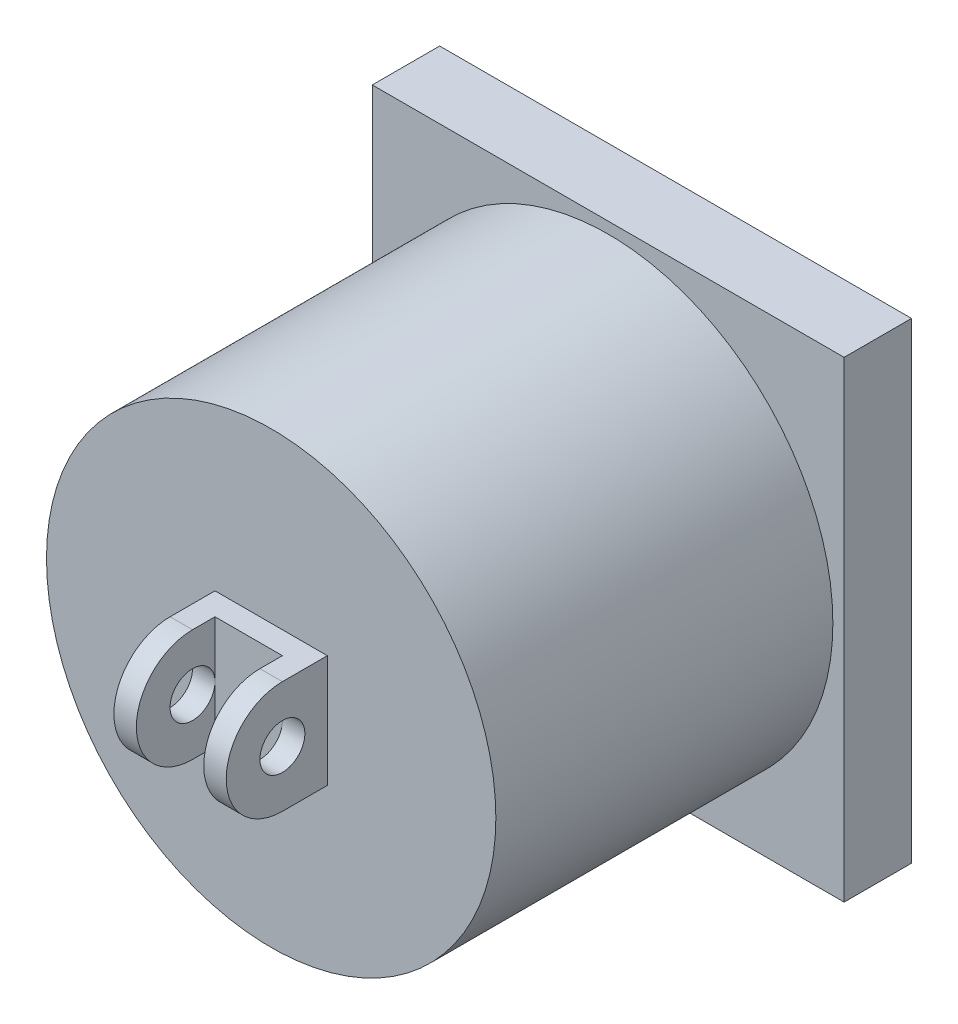
ISO-10303-21;
HEADER;
FILE_DESCRIPTION(('STEP AP214'),'2;1');
FILE_NAME('part.step','',(''),(''),'','','');
FILE_SCHEMA(('AUTOMOTIVE_DESIGN { 1 0 10303 214 1 1 1 1 }'));
ENDSEC;
DATA;
#1=APPLICATION_CONTEXT('core data for automotive mechanical design processes');
#2=APPLICATION_PROTOCOL_DEFINITION('international standard','automotive_design',2000,#1);
#3=PRODUCT_CONTEXT('',#1,'mechanical');
#4=PRODUCT('Part','Part','',(#3));
#5=PRODUCT_RELATED_PRODUCT_CATEGORY('part','',(#4));
#6=PRODUCT_DEFINITION_FORMATION('','',#4);
#7=PRODUCT_DEFINITION_CONTEXT('part definition',#1,'design');
#8=PRODUCT_DEFINITION('design','',#6,#7);
#9=PRODUCT_DEFINITION_SHAPE('','',#8);
#10=(LENGTH_UNIT() NAMED_UNIT(*) SI_UNIT(.MILLI.,.METRE.));
#11=(NAMED_UNIT(*) PLANE_ANGLE_UNIT() SI_UNIT($,.RADIAN.));
#12=(NAMED_UNIT(*) SI_UNIT($,.STERADIAN.) SOLID_ANGLE_UNIT());
#13=UNCERTAINTY_MEASURE_WITH_UNIT(LENGTH_MEASURE(1.E-05),#10,'distance_accuracy_value','');
#14=(GEOMETRIC_REPRESENTATION_CONTEXT(3) GLOBAL_UNCERTAINTY_ASSIGNED_CONTEXT((#13)) GLOBAL_UNIT_ASSIGNED_CONTEXT((#10,
#11,#12)) REPRESENTATION_CONTEXT('',''));
#15=CARTESIAN_POINT('',(0.,0.,0.));
#16=DIRECTION('',(0.,0.,1.));
#17=DIRECTION('',(1.,0.,0.));
#18=AXIS2_PLACEMENT_3D('',#15,#16,#17);
#19=CARTESIAN_POINT('',(2.5,0.,17.));
#20=DIRECTION('',(-1.,0.,0.));
#21=DIRECTION('',(0.,0.,1.));
#22=AXIS2_PLACEMENT_3D('',#19,#20,#21);
#23=CYLINDRICAL_SURFACE('',#22,2.5);
#24=DIRECTION('',(-1.,0.,0.));
#25=VECTOR('',#24,1.);
#26=CARTESIAN_POINT('',(2.5,2.5,17.));
#27=LINE('',#26,#25);
#28=CARTESIAN_POINT('',(2.5,2.5,17.));
#29=VERTEX_POINT('',#28);
#30=CARTESIAN_POINT('',(1.5,2.5,17.));
#31=VERTEX_POINT('',#30);
#32=EDGE_CURVE('E201',#29,#31,#27,.T.);
#33=ORIENTED_EDGE('',*,*,#32,.T.);
#34=CARTESIAN_POINT('',(1.5,0.,17.));
#35=DIRECTION('',(1.,0.,0.));
#36=DIRECTION('',(0.,1.,0.));
#37=AXIS2_PLACEMENT_3D('',#34,#35,#36);
#38=CIRCLE('',#37,2.5);
#39=CARTESIAN_POINT('',(1.5,-2.5,17.));
#40=VERTEX_POINT('',#39);
#41=EDGE_CURVE('E162',#31,#40,#38,.T.);
#42=ORIENTED_EDGE('',*,*,#41,.T.);
#43=DIRECTION('',(-1.,0.,0.));
#44=VECTOR('',#43,1.);
#45=CARTESIAN_POINT('',(2.5,-2.5,17.));
#46=LINE('',#45,#44);
#47=CARTESIAN_POINT('',(2.5,-2.5,17.));
#48=VERTEX_POINT('',#47);
#49=EDGE_CURVE('E153',#48,#40,#46,.T.);
#50=ORIENTED_EDGE('',*,*,#49,.F.);
#51=CARTESIAN_POINT('',(2.5,0.,17.));
#52=DIRECTION('',(1.,0.,0.));
#53=DIRECTION('',(0.,0.,-1.));
#54=AXIS2_PLACEMENT_3D('',#51,#52,#53);
#55=CIRCLE('',#54,2.5);
#56=EDGE_CURVE('E176',#29,#48,#55,.T.);
#57=ORIENTED_EDGE('',*,*,#56,.F.);
#58=EDGE_LOOP('',(#33,#42,#50,#57));
#59=FACE_BOUND('',#58,.T.);
#60=ADVANCED_FACE('F37',(#59),#23,.T.);
#61=CARTESIAN_POINT('',(2.5,0.,17.));
#62=DIRECTION('',(-1.,0.,0.));
#63=DIRECTION('',(0.,0.,1.));
#64=AXIS2_PLACEMENT_3D('',#61,#62,#63);
#65=CYLINDRICAL_SURFACE('',#64,1.);
#66=CARTESIAN_POINT('',(-1.5,0.,17.));
#67=DIRECTION('',(-1.,0.,0.));
#68=DIRECTION('',(0.,-1.,0.));
#69=AXIS2_PLACEMENT_3D('',#66,#67,#68);
#70=CIRCLE('',#69,1.);
#71=CARTESIAN_POINT('',(-1.5,0.,16.));
#72=VERTEX_POINT('',#71);
#73=EDGE_CURVE('E11',#72,#72,#70,.T.);
#74=ORIENTED_EDGE('',*,*,#73,.F.);
#75=EDGE_LOOP('',(#74));
#76=FACE_BOUND('',#75,.T.);
#77=CARTESIAN_POINT('',(-2.5,0.,17.));
#78=DIRECTION('',(1.,0.,0.));
#79=DIRECTION('',(0.,0.,-1.));
#80=AXIS2_PLACEMENT_3D('',#77,#78,#79);
#81=CIRCLE('',#80,1.);
#82=CARTESIAN_POINT('',(-2.5,0.,16.));
#83=VERTEX_POINT('',#82);
#84=EDGE_CURVE('E166',#83,#83,#81,.T.);
#85=ORIENTED_EDGE('',*,*,#84,.F.);
#86=EDGE_LOOP('',(#85));
#87=FACE_BOUND('',#86,.T.);
#88=ADVANCED_FACE('F275',(#76,#87),#65,.F.);
#89=CARTESIAN_POINT('',(0.,0.,15.));
#90=DIRECTION('',(0.,0.,1.));
#91=DIRECTION('',(1.,0.,0.));
#92=AXIS2_PLACEMENT_3D('',#89,#90,#91);
#93=PLANE('',#92);
#94=CARTESIAN_POINT('',(0.,0.,15.));
#95=DIRECTION('',(0.,0.,1.));
#96=DIRECTION('',(1.,0.,0.));
#97=AXIS2_PLACEMENT_3D('',#94,#95,#96);
#98=CIRCLE('',#97,10.);
#99=CARTESIAN_POINT('',(10.,0.,15.));
#100=VERTEX_POINT('',#99);
#101=EDGE_CURVE('E235',#100,#100,#98,.T.);
#102=ORIENTED_EDGE('',*,*,#101,.T.);
#103=EDGE_LOOP('',(#102));
#104=FACE_BOUND('',#103,.T.);
#105=DIRECTION('',(-1.,0.,0.));
#106=VECTOR('',#105,1.);
#107=CARTESIAN_POINT('',(2.5,-2.5,15.));
#108=LINE('',#107,#106);
#109=CARTESIAN_POINT('',(2.5,-2.5,15.));
#110=VERTEX_POINT('',#109);
#111=CARTESIAN_POINT('',(-2.5,-2.5,15.));
#112=VERTEX_POINT('',#111);
#113=EDGE_CURVE('E195',#110,#112,#108,.T.);
#114=ORIENTED_EDGE('',*,*,#113,.T.);
#115=DIRECTION('',(0.,1.,0.));
#116=VECTOR('',#115,1.);
#117=CARTESIAN_POINT('',(-2.5,2.5,15.));
#118=LINE('',#117,#116);
#119=CARTESIAN_POINT('',(-2.5,2.5,15.));
#120=VERTEX_POINT('',#119);
#121=EDGE_CURVE('E177',#112,#120,#118,.T.);
#122=ORIENTED_EDGE('',*,*,#121,.T.);
#123=DIRECTION('',(-1.,0.,0.));
#124=VECTOR('',#123,1.);
#125=CARTESIAN_POINT('',(2.5,2.5,15.));
#126=LINE('',#125,#124);
#127=CARTESIAN_POINT('',(2.5,2.5,15.));
#128=VERTEX_POINT('',#127);
#129=EDGE_CURVE('E183',#128,#120,#126,.T.);
#130=ORIENTED_EDGE('',*,*,#129,.F.);
#131=DIRECTION('',(0.,1.,0.));
#132=VECTOR('',#131,1.);
#133=CARTESIAN_POINT('',(2.5,2.5,15.));
#134=LINE('',#133,#132);
#135=EDGE_CURVE('E181',#110,#128,#134,.T.);
#136=ORIENTED_EDGE('',*,*,#135,.F.);
#137=EDGE_LOOP('',(#114,#122,#130,#136));
#138=FACE_BOUND('',#137,.T.);
#139=ADVANCED_FACE('F282',(#104,#138),#93,.T.);
#140=CARTESIAN_POINT('',(0.,0.,15.));
#141=DIRECTION('',(0.,0.,-1.));
#142=DIRECTION('',(-1.,0.,0.));
#143=AXIS2_PLACEMENT_3D('',#140,#141,#142);
#144=CYLINDRICAL_SURFACE('',#143,10.);
#145=ORIENTED_EDGE('',*,*,#101,.F.);
#146=EDGE_LOOP('',(#145));
#147=FACE_BOUND('',#146,.T.);
#148=CARTESIAN_POINT('',(0.,0.,0.));
#149=DIRECTION('',(0.,0.,1.));
#150=DIRECTION('',(1.,0.,0.));
#151=AXIS2_PLACEMENT_3D('',#148,#149,#150);
#152=CIRCLE('',#151,10.);
#153=CARTESIAN_POINT('',(10.,0.,0.));
#154=VERTEX_POINT('',#153);
#155=EDGE_CURVE('E234',#154,#154,#152,.T.);
#156=ORIENTED_EDGE('',*,*,#155,.T.);
#157=EDGE_LOOP('',(#156));
#158=FACE_BOUND('',#157,.T.);
#159=ADVANCED_FACE('F39',(#147,#158),#144,.T.);
#160=CARTESIAN_POINT('',(10.5,-10.5,-3.));
#161=DIRECTION('',(-1.,0.,0.));
#162=DIRECTION('',(0.,0.,1.));
#163=AXIS2_PLACEMENT_3D('',#160,#161,#162);
#164=PLANE('',#163);
#165=DIRECTION('',(0.,-1.,0.));
#166=VECTOR('',#165,1.);
#167=CARTESIAN_POINT('',(10.5,-10.5,0.));
#168=LINE('',#167,#166);
#169=CARTESIAN_POINT('',(10.5,10.5,0.));
#170=VERTEX_POINT('',#169);
#171=CARTESIAN_POINT('',(10.5,-10.5,0.));
#172=VERTEX_POINT('',#171);
#173=EDGE_CURVE('E204',#170,#172,#168,.T.);
#174=ORIENTED_EDGE('',*,*,#173,.T.);
#175=DIRECTION('',(0.,0.,1.));
#176=VECTOR('',#175,1.);
#177=CARTESIAN_POINT('',(10.5,-10.5,-3.));
#178=LINE('',#177,#176);
#179=CARTESIAN_POINT('',(10.5,-10.5,-3.));
#180=VERTEX_POINT('',#179);
#181=EDGE_CURVE('E231',#180,#172,#178,.T.);
#182=ORIENTED_EDGE('',*,*,#181,.F.);
#183=DIRECTION('',(0.,-1.,0.));
#184=VECTOR('',#183,1.);
#185=CARTESIAN_POINT('',(10.5,-10.5,-3.));
#186=LINE('',#185,#184);
#187=CARTESIAN_POINT('',(10.5,10.5,-3.));
#188=VERTEX_POINT('',#187);
#189=EDGE_CURVE('E205',#188,#180,#186,.T.);
#190=ORIENTED_EDGE('',*,*,#189,.F.);
#191=DIRECTION('',(0.,0.,1.));
#192=VECTOR('',#191,1.);
#193=CARTESIAN_POINT('',(10.5,10.5,-3.));
#194=LINE('',#193,#192);
#195=EDGE_CURVE('E215',#188,#170,#194,.T.);
#196=ORIENTED_EDGE('',*,*,#195,.T.);
#197=EDGE_LOOP('',(#174,#182,#190,#196));
#198=FACE_BOUND('',#197,.T.);
#199=ADVANCED_FACE('F253',(#198),#164,.F.);
#200=CARTESIAN_POINT('',(-10.5,-10.5,-3.));
#201=DIRECTION('',(0.,1.,0.));
#202=DIRECTION('',(-1.,0.,0.));
#203=AXIS2_PLACEMENT_3D('',#200,#201,#202);
#204=PLANE('',#203);
#205=DIRECTION('',(-1.,0.,0.));
#206=VECTOR('',#205,1.);
#207=CARTESIAN_POINT('',(-10.5,-10.5,0.));
#208=LINE('',#207,#206);
#209=CARTESIAN_POINT('',(-10.5,-10.5,0.));
#210=VERTEX_POINT('',#209);
#211=EDGE_CURVE('E218',#172,#210,#208,.T.);
#212=ORIENTED_EDGE('',*,*,#211,.T.);
#213=DIRECTION('',(0.,0.,1.));
#214=VECTOR('',#213,1.);
#215=CARTESIAN_POINT('',(-10.5,-10.5,-3.));
#216=LINE('',#215,#214);
#217=CARTESIAN_POINT('',(-10.5,-10.5,-3.));
#218=VERTEX_POINT('',#217);
#219=EDGE_CURVE('E228',#218,#210,#216,.T.);
#220=ORIENTED_EDGE('',*,*,#219,.F.);
#221=DIRECTION('',(-1.,0.,0.));
#222=VECTOR('',#221,1.);
#223=CARTESIAN_POINT('',(-10.5,-10.5,-3.));
#224=LINE('',#223,#222);
#225=EDGE_CURVE('E208',#180,#218,#224,.T.);
#226=ORIENTED_EDGE('',*,*,#225,.F.);
#227=ORIENTED_EDGE('',*,*,#181,.T.);
#228=EDGE_LOOP('',(#212,#220,#226,#227));
#229=FACE_BOUND('',#228,.T.);
#230=ADVANCED_FACE('F265',(#229),#204,.F.);
#231=CARTESIAN_POINT('',(-10.5,-10.5,-3.));
#232=DIRECTION('',(1.,0.,0.));
#233=DIRECTION('',(0.,0.,-1.));
#234=AXIS2_PLACEMENT_3D('',#231,#232,#233);
#235=PLANE('',#234);
#236=DIRECTION('',(0.,1.,0.));
#237=VECTOR('',#236,1.);
#238=CARTESIAN_POINT('',(-10.5,-10.5,0.));
#239=LINE('',#238,#237);
#240=CARTESIAN_POINT('',(-10.5,10.5,0.));
#241=VERTEX_POINT('',#240);
#242=EDGE_CURVE('E220',#210,#241,#239,.T.);
#243=ORIENTED_EDGE('',*,*,#242,.T.);
#244=DIRECTION('',(0.,0.,1.));
#245=VECTOR('',#244,1.);
#246=CARTESIAN_POINT('',(-10.5,10.5,-3.));
#247=LINE('',#246,#245);
#248=CARTESIAN_POINT('',(-10.5,10.5,-3.));
#249=VERTEX_POINT('',#248);
#250=EDGE_CURVE('E225',#249,#241,#247,.T.);
#251=ORIENTED_EDGE('',*,*,#250,.F.);
#252=DIRECTION('',(0.,1.,0.));
#253=VECTOR('',#252,1.);
#254=CARTESIAN_POINT('',(-10.5,-10.5,-3.));
#255=LINE('',#254,#253);
#256=EDGE_CURVE('E211',#218,#249,#255,.T.);
#257=ORIENTED_EDGE('',*,*,#256,.F.);
#258=ORIENTED_EDGE('',*,*,#219,.T.);
#259=EDGE_LOOP('',(#243,#251,#257,#258));
#260=FACE_BOUND('',#259,.T.);
#261=ADVANCED_FACE('F262',(#260),#235,.F.);
#262=CARTESIAN_POINT('',(-10.5,10.5,-3.));
#263=DIRECTION('',(0.,-1.,0.));
#264=DIRECTION('',(1.,0.,0.));
#265=AXIS2_PLACEMENT_3D('',#262,#263,#264);
#266=PLANE('',#265);
#267=DIRECTION('',(1.,0.,0.));
#268=VECTOR('',#267,1.);
#269=CARTESIAN_POINT('',(-10.5,10.5,0.));
#270=LINE('',#269,#268);
#271=EDGE_CURVE('E209',#241,#170,#270,.T.);
#272=ORIENTED_EDGE('',*,*,#271,.T.);
#273=ORIENTED_EDGE('',*,*,#195,.F.);
#274=DIRECTION('',(1.,0.,0.));
#275=VECTOR('',#274,1.);
#276=CARTESIAN_POINT('',(-10.5,10.5,-3.));
#277=LINE('',#276,#275);
#278=EDGE_CURVE('E213',#249,#188,#277,.T.);
#279=ORIENTED_EDGE('',*,*,#278,.F.);
#280=ORIENTED_EDGE('',*,*,#250,.T.);
#281=EDGE_LOOP('',(#272,#273,#279,#280));
#282=FACE_BOUND('',#281,.T.);
#283=ADVANCED_FACE('F258',(#282),#266,.F.);
#284=CARTESIAN_POINT('',(0.,0.,-3.));
#285=DIRECTION('',(0.,0.,-1.));
#286=DIRECTION('',(-1.,0.,0.));
#287=AXIS2_PLACEMENT_3D('',#284,#285,#286);
#288=PLANE('',#287);
#289=ORIENTED_EDGE('',*,*,#189,.T.);
#290=ORIENTED_EDGE('',*,*,#225,.T.);
#291=ORIENTED_EDGE('',*,*,#256,.T.);
#292=ORIENTED_EDGE('',*,*,#278,.T.);
#293=EDGE_LOOP('',(#289,#290,#291,#292));
#294=FACE_BOUND('',#293,.T.);
#295=ADVANCED_FACE('F246',(#294),#288,.T.);
#296=CARTESIAN_POINT('',(0.,0.,0.));
#297=DIRECTION('',(0.,0.,-1.));
#298=DIRECTION('',(-1.,0.,0.));
#299=AXIS2_PLACEMENT_3D('',#296,#297,#298);
#300=PLANE('',#299);
#301=ORIENTED_EDGE('',*,*,#155,.F.);
#302=EDGE_LOOP('',(#301));
#303=FACE_BOUND('',#302,.T.);
#304=ORIENTED_EDGE('',*,*,#173,.F.);
#305=ORIENTED_EDGE('',*,*,#271,.F.);
#306=ORIENTED_EDGE('',*,*,#242,.F.);
#307=ORIENTED_EDGE('',*,*,#211,.F.);
#308=EDGE_LOOP('',(#304,#305,#306,#307));
#309=FACE_BOUND('',#308,.T.);
#310=ADVANCED_FACE('F242',(#303,#309),#300,.F.);
#311=CARTESIAN_POINT('',(2.5,0.,17.));
#312=DIRECTION('',(1.,0.,0.));
#313=DIRECTION('',(0.,0.,-1.));
#314=AXIS2_PLACEMENT_3D('',#311,#312,#313);
#315=PLANE('',#314);
#316=DIRECTION('',(0.,0.,1.));
#317=VECTOR('',#316,1.);
#318=CARTESIAN_POINT('',(2.5,2.5,15.));
#319=LINE('',#318,#317);
#320=EDGE_CURVE('E173',#128,#29,#319,.T.);
#321=ORIENTED_EDGE('',*,*,#320,.T.);
#322=ORIENTED_EDGE('',*,*,#56,.T.);
#323=DIRECTION('',(0.,0.,-1.));
#324=VECTOR('',#323,1.);
#325=CARTESIAN_POINT('',(2.5,-2.5,15.));
#326=LINE('',#325,#324);
#327=EDGE_CURVE('E179',#48,#110,#326,.T.);
#328=ORIENTED_EDGE('',*,*,#327,.T.);
#329=ORIENTED_EDGE('',*,*,#135,.T.);
#330=EDGE_LOOP('',(#321,#322,#328,#329));
#331=FACE_BOUND('',#330,.T.);
#332=CARTESIAN_POINT('',(2.5,0.,17.));
#333=DIRECTION('',(1.,0.,0.));
#334=DIRECTION('',(0.,0.,-1.));
#335=AXIS2_PLACEMENT_3D('',#332,#333,#334);
#336=CIRCLE('',#335,1.);
#337=CARTESIAN_POINT('',(2.5,0.,16.));
#338=VERTEX_POINT('',#337);
#339=EDGE_CURVE('E167',#338,#338,#336,.T.);
#340=ORIENTED_EDGE('',*,*,#339,.F.);
#341=EDGE_LOOP('',(#340));
#342=FACE_BOUND('',#341,.T.);
#343=ADVANCED_FACE('F245',(#331,#342),#315,.T.);
#344=CARTESIAN_POINT('',(-2.5,0.,17.));
#345=DIRECTION('',(1.,0.,0.));
#346=DIRECTION('',(0.,0.,-1.));
#347=AXIS2_PLACEMENT_3D('',#344,#345,#346);
#348=PLANE('',#347);
#349=DIRECTION('',(0.,0.,1.));
#350=VECTOR('',#349,1.);
#351=CARTESIAN_POINT('',(-2.5,2.5,15.));
#352=LINE('',#351,#350);
#353=CARTESIAN_POINT('',(-2.5,2.5,17.));
#354=VERTEX_POINT('',#353);
#355=EDGE_CURVE('E170',#120,#354,#352,.T.);
#356=ORIENTED_EDGE('',*,*,#355,.F.);
#357=ORIENTED_EDGE('',*,*,#121,.F.);
#358=DIRECTION('',(0.,0.,-1.));
#359=VECTOR('',#358,1.);
#360=CARTESIAN_POINT('',(-2.5,-2.5,15.));
#361=LINE('',#360,#359);
#362=CARTESIAN_POINT('',(-2.5,-2.5,17.));
#363=VERTEX_POINT('',#362);
#364=EDGE_CURVE('E189',#363,#112,#361,.T.);
#365=ORIENTED_EDGE('',*,*,#364,.F.);
#366=CARTESIAN_POINT('',(-2.5,0.,17.));
#367=DIRECTION('',(1.,0.,0.));
#368=DIRECTION('',(0.,0.,-1.));
#369=AXIS2_PLACEMENT_3D('',#366,#367,#368);
#370=CIRCLE('',#369,2.5);
#371=EDGE_CURVE('E186',#354,#363,#370,.T.);
#372=ORIENTED_EDGE('',*,*,#371,.F.);
#373=EDGE_LOOP('',(#356,#357,#365,#372));
#374=FACE_BOUND('',#373,.T.);
#375=ORIENTED_EDGE('',*,*,#84,.T.);
#376=EDGE_LOOP('',(#375));
#377=FACE_BOUND('',#376,.T.);
#378=ADVANCED_FACE('F294',(#374,#377),#348,.F.);
#379=CARTESIAN_POINT('',(2.5,2.5,15.));
#380=DIRECTION('',(0.,-1.,0.));
#381=DIRECTION('',(0.,0.,-1.));
#382=AXIS2_PLACEMENT_3D('',#379,#380,#381);
#383=PLANE('',#382);
#384=CARTESIAN_POINT('',(-1.5,2.5,17.));
#385=VERTEX_POINT('',#384);
#386=EDGE_CURVE('E200',#385,#354,#27,.T.);
#387=ORIENTED_EDGE('',*,*,#386,.F.);
#388=DIRECTION('',(0.,0.,1.));
#389=VECTOR('',#388,1.);
#390=CARTESIAN_POINT('',(-1.5,2.5,16.));
#391=LINE('',#390,#389);
#392=CARTESIAN_POINT('',(-1.5,2.5,16.));
#393=VERTEX_POINT('',#392);
#394=EDGE_CURVE('E157',#393,#385,#391,.T.);
#395=ORIENTED_EDGE('',*,*,#394,.F.);
#396=DIRECTION('',(-1.,0.,0.));
#397=VECTOR('',#396,1.);
#398=CARTESIAN_POINT('',(-1.5,2.5,16.));
#399=LINE('',#398,#397);
#400=CARTESIAN_POINT('',(1.5,2.5,16.));
#401=VERTEX_POINT('',#400);
#402=EDGE_CURVE('E141',#401,#393,#399,.T.);
#403=ORIENTED_EDGE('',*,*,#402,.F.);
#404=DIRECTION('',(0.,0.,1.));
#405=VECTOR('',#404,1.);
#406=CARTESIAN_POINT('',(1.5,2.5,16.));
#407=LINE('',#406,#405);
#408=EDGE_CURVE('E154',#401,#31,#407,.T.);
#409=ORIENTED_EDGE('',*,*,#408,.T.);
#410=ORIENTED_EDGE('',*,*,#32,.F.);
#411=ORIENTED_EDGE('',*,*,#320,.F.);
#412=ORIENTED_EDGE('',*,*,#129,.T.);
#413=ORIENTED_EDGE('',*,*,#355,.T.);
#414=EDGE_LOOP('',(#387,#395,#403,#409,#410,#411,#412,#413));
#415=FACE_BOUND('',#414,.T.);
#416=ADVANCED_FACE('F288',(#415),#383,.F.);
#417=CARTESIAN_POINT('',(-1.5,-2.5,17.));
#418=VERTEX_POINT('',#417);
#419=EDGE_CURVE('E198',#418,#363,#46,.T.);
#420=ORIENTED_EDGE('',*,*,#419,.F.);
#421=CARTESIAN_POINT('',(-1.5,0.,17.));
#422=DIRECTION('',(-1.,0.,0.));
#423=DIRECTION('',(0.,-1.,0.));
#424=AXIS2_PLACEMENT_3D('',#421,#422,#423);
#425=CIRCLE('',#424,2.5);
#426=EDGE_CURVE('E164',#418,#385,#425,.T.);
#427=ORIENTED_EDGE('',*,*,#426,.T.);
#428=ORIENTED_EDGE('',*,*,#386,.T.);
#429=ORIENTED_EDGE('',*,*,#371,.T.);
#430=EDGE_LOOP('',(#420,#427,#428,#429));
#431=FACE_BOUND('',#430,.T.);
#432=ADVANCED_FACE('F278',(#431),#23,.T.);
#433=CARTESIAN_POINT('',(2.5,-2.5,15.));
#434=DIRECTION('',(0.,1.,0.));
#435=DIRECTION('',(0.,0.,1.));
#436=AXIS2_PLACEMENT_3D('',#433,#434,#435);
#437=PLANE('',#436);
#438=DIRECTION('',(1.,0.,0.));
#439=VECTOR('',#438,1.);
#440=CARTESIAN_POINT('',(-1.5,-2.5,16.));
#441=LINE('',#440,#439);
#442=CARTESIAN_POINT('',(-1.5,-2.5,16.));
#443=VERTEX_POINT('',#442);
#444=CARTESIAN_POINT('',(1.5,-2.5,16.));
#445=VERTEX_POINT('',#444);
#446=EDGE_CURVE('E145',#443,#445,#441,.T.);
#447=ORIENTED_EDGE('',*,*,#446,.F.);
#448=DIRECTION('',(0.,0.,1.));
#449=VECTOR('',#448,1.);
#450=CARTESIAN_POINT('',(-1.5,-2.5,16.));
#451=LINE('',#450,#449);
#452=EDGE_CURVE('E52',#443,#418,#451,.T.);
#453=ORIENTED_EDGE('',*,*,#452,.T.);
#454=ORIENTED_EDGE('',*,*,#419,.T.);
#455=ORIENTED_EDGE('',*,*,#364,.T.);
#456=ORIENTED_EDGE('',*,*,#113,.F.);
#457=ORIENTED_EDGE('',*,*,#327,.F.);
#458=ORIENTED_EDGE('',*,*,#49,.T.);
#459=DIRECTION('',(0.,0.,1.));
#460=VECTOR('',#459,1.);
#461=CARTESIAN_POINT('',(1.5,-2.5,16.));
#462=LINE('',#461,#460);
#463=EDGE_CURVE('E137',#445,#40,#462,.T.);
#464=ORIENTED_EDGE('',*,*,#463,.F.);
#465=EDGE_LOOP('',(#447,#453,#454,#455,#456,#457,#458,#464));
#466=FACE_BOUND('',#465,.T.);
#467=ADVANCED_FACE('F150',(#466),#437,.F.);
#468=CARTESIAN_POINT('',(1.5,0.,17.));
#469=DIRECTION('',(1.,0.,0.));
#470=DIRECTION('',(0.,1.,0.));
#471=AXIS2_PLACEMENT_3D('',#468,#469,#470);
#472=CIRCLE('',#471,1.);
#473=CARTESIAN_POINT('',(1.5,0.,16.));
#474=VERTEX_POINT('',#473);
#475=EDGE_CURVE('E45',#474,#474,#472,.T.);
#476=ORIENTED_EDGE('',*,*,#475,.F.);
#477=EDGE_LOOP('',(#476));
#478=FACE_BOUND('',#477,.T.);
#479=ORIENTED_EDGE('',*,*,#339,.T.);
#480=EDGE_LOOP('',(#479));
#481=FACE_BOUND('',#480,.T.);
#482=ADVANCED_FACE('F285',(#478,#481),#65,.F.);
#483=CARTESIAN_POINT('',(-1.5,2.5,16.));
#484=DIRECTION('',(-1.,0.,0.));
#485=DIRECTION('',(0.,-1.,0.));
#486=AXIS2_PLACEMENT_3D('',#483,#484,#485);
#487=PLANE('',#486);
#488=ORIENTED_EDGE('',*,*,#452,.F.);
#489=DIRECTION('',(0.,-1.,0.));
#490=VECTOR('',#489,1.);
#491=CARTESIAN_POINT('',(-1.5,2.5,16.));
#492=LINE('',#491,#490);
#493=EDGE_CURVE('E147',#72,#443,#492,.T.);
#494=ORIENTED_EDGE('',*,*,#493,.F.);
#495=ORIENTED_EDGE('',*,*,#73,.T.);
#496=EDGE_CURVE('E59',#393,#72,#492,.T.);
#497=ORIENTED_EDGE('',*,*,#496,.F.);
#498=ORIENTED_EDGE('',*,*,#394,.T.);
#499=ORIENTED_EDGE('',*,*,#426,.F.);
#500=EDGE_LOOP('',(#488,#494,#495,#497,#498,#499));
#501=FACE_BOUND('',#500,.T.);
#502=ADVANCED_FACE('F314',(#501),#487,.F.);
#503=CARTESIAN_POINT('',(1.5,2.5,16.));
#504=DIRECTION('',(1.,0.,0.));
#505=DIRECTION('',(0.,1.,0.));
#506=AXIS2_PLACEMENT_3D('',#503,#504,#505);
#507=PLANE('',#506);
#508=ORIENTED_EDGE('',*,*,#408,.F.);
#509=DIRECTION('',(0.,1.,0.));
#510=VECTOR('',#509,1.);
#511=CARTESIAN_POINT('',(1.5,2.5,16.));
#512=LINE('',#511,#510);
#513=EDGE_CURVE('E142',#474,#401,#512,.T.);
#514=ORIENTED_EDGE('',*,*,#513,.F.);
#515=ORIENTED_EDGE('',*,*,#475,.T.);
#516=EDGE_CURVE('E132',#445,#474,#512,.T.);
#517=ORIENTED_EDGE('',*,*,#516,.F.);
#518=ORIENTED_EDGE('',*,*,#463,.T.);
#519=ORIENTED_EDGE('',*,*,#41,.F.);
#520=EDGE_LOOP('',(#508,#514,#515,#517,#518,#519));
#521=FACE_BOUND('',#520,.T.);
#522=ADVANCED_FACE('F135',(#521),#507,.F.);
#523=CARTESIAN_POINT('',(0.,0.,16.));
#524=DIRECTION('',(0.,0.,1.));
#525=DIRECTION('',(1.,0.,0.));
#526=AXIS2_PLACEMENT_3D('',#523,#524,#525);
#527=PLANE('',#526);
#528=ORIENTED_EDGE('',*,*,#516,.T.);
#529=ORIENTED_EDGE('',*,*,#513,.T.);
#530=ORIENTED_EDGE('',*,*,#402,.T.);
#531=ORIENTED_EDGE('',*,*,#496,.T.);
#532=ORIENTED_EDGE('',*,*,#493,.T.);
#533=ORIENTED_EDGE('',*,*,#446,.T.);
#534=EDGE_LOOP('',(#528,#529,#530,#531,#532,#533));
#535=FACE_BOUND('',#534,.T.);
#536=ADVANCED_FACE('F146',(#535),#527,.T.);
#537=CLOSED_SHELL('',(#60,#88,#139,#159,#199,#230,#261,#283,#295,#310,#343,#378,#416,#432,#467,
#482,#502,#522,#536));
#538=MANIFOLD_SOLID_BREP('B2',#537);
#539=ADVANCED_BREP_SHAPE_REPRESENTATION('',(#18,#538),#14);
#540=SHAPE_DEFINITION_REPRESENTATION(#9,#539);
ENDSEC;
END-ISO-10303-21;
